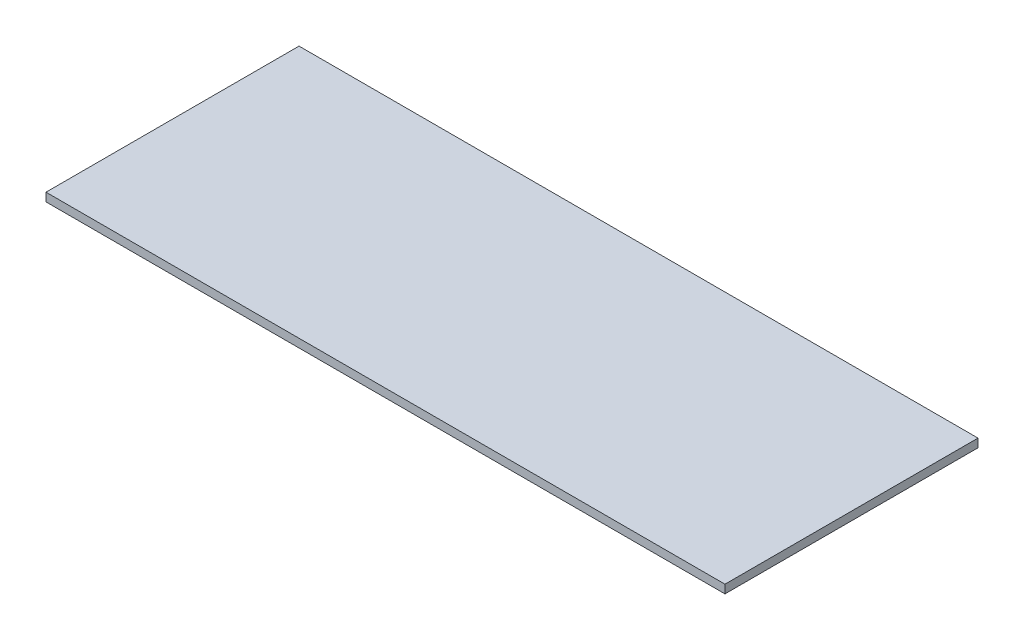
ISO-10303-21;
HEADER;
FILE_DESCRIPTION(('STEP AP214'),'2;1');
FILE_NAME('part.step','',(''),(''),'','','');
FILE_SCHEMA(('AUTOMOTIVE_DESIGN { 1 0 10303 214 1 1 1 1 }'));
ENDSEC;
DATA;
#1=APPLICATION_CONTEXT('core data for automotive mechanical design processes');
#2=APPLICATION_PROTOCOL_DEFINITION('international standard','automotive_design',2000,#1);
#3=PRODUCT_CONTEXT('',#1,'mechanical');
#4=PRODUCT('Part','Part','',(#3));
#5=PRODUCT_RELATED_PRODUCT_CATEGORY('part','',(#4));
#6=PRODUCT_DEFINITION_FORMATION('','',#4);
#7=PRODUCT_DEFINITION_CONTEXT('part definition',#1,'design');
#8=PRODUCT_DEFINITION('design','',#6,#7);
#9=PRODUCT_DEFINITION_SHAPE('','',#8);
#10=(LENGTH_UNIT() NAMED_UNIT(*) SI_UNIT(.MILLI.,.METRE.));
#11=(NAMED_UNIT(*) PLANE_ANGLE_UNIT() SI_UNIT($,.RADIAN.));
#12=(NAMED_UNIT(*) SI_UNIT($,.STERADIAN.) SOLID_ANGLE_UNIT());
#13=UNCERTAINTY_MEASURE_WITH_UNIT(LENGTH_MEASURE(1.E-05),#10,'distance_accuracy_value','');
#14=(GEOMETRIC_REPRESENTATION_CONTEXT(3) GLOBAL_UNCERTAINTY_ASSIGNED_CONTEXT((#13)) GLOBAL_UNIT_ASSIGNED_CONTEXT((#10,
#11,#12)) REPRESENTATION_CONTEXT('',''));
#15=CARTESIAN_POINT('',(0.,0.,0.));
#16=DIRECTION('',(0.,0.,1.));
#17=DIRECTION('',(1.,0.,0.));
#18=AXIS2_PLACEMENT_3D('',#15,#16,#17);
#19=CARTESIAN_POINT('',(0.,6.35,0.));
#20=DIRECTION('',(0.,1.,0.));
#21=DIRECTION('',(0.,0.,1.));
#22=AXIS2_PLACEMENT_3D('',#19,#20,#21);
#23=PLANE('',#22);
#24=DIRECTION('',(0.,0.,-1.));
#25=VECTOR('',#24,1.);
#26=CARTESIAN_POINT('',(123.819999999999,6.35,95.250000000004));
#27=LINE('',#26,#25);
#28=CARTESIAN_POINT('',(123.819999999999,6.35,95.250000000004));
#29=VERTEX_POINT('',#28);
#30=CARTESIAN_POINT('',(123.819999999999,6.35,-95.249999999996));
#31=VERTEX_POINT('',#30);
#32=EDGE_CURVE('E86',#29,#31,#27,.T.);
#33=ORIENTED_EDGE('',*,*,#32,.T.);
#34=DIRECTION('',(-1.,0.,0.));
#35=VECTOR('',#34,1.);
#36=CARTESIAN_POINT('',(-387.350000000001,6.35,-95.249999999996));
#37=LINE('',#36,#35);
#38=CARTESIAN_POINT('',(-387.350000000001,6.35,-95.249999999996));
#39=VERTEX_POINT('',#38);
#40=EDGE_CURVE('E95',#31,#39,#37,.T.);
#41=ORIENTED_EDGE('',*,*,#40,.T.);
#42=DIRECTION('',(0.,0.,1.));
#43=VECTOR('',#42,1.);
#44=CARTESIAN_POINT('',(-387.350000000001,6.35,-95.249999999996));
#45=LINE('',#44,#43);
#46=CARTESIAN_POINT('',(-387.350000000001,6.35,95.250000000004));
#47=VERTEX_POINT('',#46);
#48=EDGE_CURVE('E110',#39,#47,#45,.T.);
#49=ORIENTED_EDGE('',*,*,#48,.T.);
#50=DIRECTION('',(1.,0.,0.));
#51=VECTOR('',#50,1.);
#52=CARTESIAN_POINT('',(-387.350000000001,6.35,95.250000000004));
#53=LINE('',#52,#51);
#54=EDGE_CURVE('E98',#47,#29,#53,.T.);
#55=ORIENTED_EDGE('',*,*,#54,.T.);
#56=EDGE_LOOP('',(#33,#41,#49,#55));
#57=FACE_BOUND('',#56,.T.);
#58=ADVANCED_FACE('F42',(#57),#23,.T.);
#59=CARTESIAN_POINT('',(-387.350000000001,-797.778377746602,95.250000000004));
#60=DIRECTION('',(0.,0.,1.));
#61=DIRECTION('',(1.,0.,0.));
#62=AXIS2_PLACEMENT_3D('',#59,#60,#61);
#63=PLANE('',#62);
#64=DIRECTION('',(0.,-1.,0.));
#65=VECTOR('',#64,1.);
#66=CARTESIAN_POINT('',(123.819999999999,6.35,95.250000000004));
#67=LINE('',#66,#65);
#68=CARTESIAN_POINT('',(123.819999999999,0.,95.250000000004));
#69=VERTEX_POINT('',#68);
#70=EDGE_CURVE('E60',#29,#69,#67,.T.);
#71=ORIENTED_EDGE('',*,*,#70,.F.);
#72=ORIENTED_EDGE('',*,*,#54,.F.);
#73=DIRECTION('',(0.,1.,0.));
#74=VECTOR('',#73,1.);
#75=CARTESIAN_POINT('',(-387.350000000001,-797.778377746602,95.250000000004));
#76=LINE('',#75,#74);
#77=CARTESIAN_POINT('',(-387.350000000001,0.,95.250000000004));
#78=VERTEX_POINT('',#77);
#79=EDGE_CURVE('E46',#78,#47,#76,.T.);
#80=ORIENTED_EDGE('',*,*,#79,.F.);
#81=DIRECTION('',(-1.,0.,0.));
#82=VECTOR('',#81,1.);
#83=CARTESIAN_POINT('',(-387.350000000001,0.,95.250000000004));
#84=LINE('',#83,#82);
#85=EDGE_CURVE('E11',#69,#78,#84,.T.);
#86=ORIENTED_EDGE('',*,*,#85,.F.);
#87=EDGE_LOOP('',(#71,#72,#80,#86));
#88=FACE_BOUND('',#87,.T.);
#89=ADVANCED_FACE('F136',(#88),#63,.T.);
#90=CARTESIAN_POINT('',(-387.350000000001,-797.778377746602,-95.249999999996));
#91=DIRECTION('',(0.,0.,-1.));
#92=DIRECTION('',(-1.,0.,0.));
#93=AXIS2_PLACEMENT_3D('',#90,#91,#92);
#94=PLANE('',#93);
#95=DIRECTION('',(0.,-1.,0.));
#96=VECTOR('',#95,1.);
#97=CARTESIAN_POINT('',(123.819999999999,6.35,-95.249999999996));
#98=LINE('',#97,#96);
#99=CARTESIAN_POINT('',(123.819999999999,0.,-95.249999999996));
#100=VERTEX_POINT('',#99);
#101=EDGE_CURVE('E83',#31,#100,#98,.T.);
#102=ORIENTED_EDGE('',*,*,#101,.T.);
#103=DIRECTION('',(1.,0.,0.));
#104=VECTOR('',#103,1.);
#105=CARTESIAN_POINT('',(-387.350000000001,0.,-95.249999999996));
#106=LINE('',#105,#104);
#107=CARTESIAN_POINT('',(-387.350000000001,0.,-95.249999999996));
#108=VERTEX_POINT('',#107);
#109=EDGE_CURVE('E114',#108,#100,#106,.T.);
#110=ORIENTED_EDGE('',*,*,#109,.F.);
#111=DIRECTION('',(0.,1.,0.));
#112=VECTOR('',#111,1.);
#113=CARTESIAN_POINT('',(-387.350000000001,-797.778377746602,-95.249999999996));
#114=LINE('',#113,#112);
#115=EDGE_CURVE('E103',#108,#39,#114,.T.);
#116=ORIENTED_EDGE('',*,*,#115,.T.);
#117=ORIENTED_EDGE('',*,*,#40,.F.);
#118=EDGE_LOOP('',(#102,#110,#116,#117));
#119=FACE_BOUND('',#118,.T.);
#120=ADVANCED_FACE('F101',(#119),#94,.T.);
#121=CARTESIAN_POINT('',(-387.350000000001,-797.778377746602,-95.249999999996));
#122=DIRECTION('',(-1.,0.,0.));
#123=DIRECTION('',(0.,0.,1.));
#124=AXIS2_PLACEMENT_3D('',#121,#122,#123);
#125=PLANE('',#124);
#126=DIRECTION('',(0.,0.,-1.));
#127=VECTOR('',#126,1.);
#128=CARTESIAN_POINT('',(-387.350000000001,0.,-95.249999999996));
#129=LINE('',#128,#127);
#130=EDGE_CURVE('E52',#78,#108,#129,.T.);
#131=ORIENTED_EDGE('',*,*,#130,.F.);
#132=ORIENTED_EDGE('',*,*,#79,.T.);
#133=ORIENTED_EDGE('',*,*,#48,.F.);
#134=ORIENTED_EDGE('',*,*,#115,.F.);
#135=EDGE_LOOP('',(#131,#132,#133,#134));
#136=FACE_BOUND('',#135,.T.);
#137=ADVANCED_FACE('F132',(#136),#125,.T.);
#138=CARTESIAN_POINT('',(0.,0.,0.));
#139=DIRECTION('',(0.,1.,0.));
#140=DIRECTION('',(0.,0.,1.));
#141=AXIS2_PLACEMENT_3D('',#138,#139,#140);
#142=PLANE('',#141);
#143=ORIENTED_EDGE('',*,*,#109,.T.);
#144=DIRECTION('',(0.,0.,-1.));
#145=VECTOR('',#144,1.);
#146=CARTESIAN_POINT('',(123.819999999999,0.,95.250000000004));
#147=LINE('',#146,#145);
#148=EDGE_CURVE('E87',#69,#100,#147,.T.);
#149=ORIENTED_EDGE('',*,*,#148,.F.);
#150=ORIENTED_EDGE('',*,*,#85,.T.);
#151=ORIENTED_EDGE('',*,*,#130,.T.);
#152=EDGE_LOOP('',(#143,#149,#150,#151));
#153=FACE_BOUND('',#152,.T.);
#154=ADVANCED_FACE('F44',(#153),#142,.F.);
#155=CARTESIAN_POINT('',(123.819999999999,6.35,95.250000000004));
#156=DIRECTION('',(-1.,0.,0.));
#157=DIRECTION('',(0.,0.,1.));
#158=AXIS2_PLACEMENT_3D('',#155,#156,#157);
#159=PLANE('',#158);
#160=ORIENTED_EDGE('',*,*,#148,.T.);
#161=ORIENTED_EDGE('',*,*,#101,.F.);
#162=ORIENTED_EDGE('',*,*,#32,.F.);
#163=ORIENTED_EDGE('',*,*,#70,.T.);
#164=EDGE_LOOP('',(#160,#161,#162,#163));
#165=FACE_BOUND('',#164,.T.);
#166=ADVANCED_FACE('F85',(#165),#159,.F.);
#167=CLOSED_SHELL('',(#58,#89,#120,#137,#154,#166));
#168=MANIFOLD_SOLID_BREP('B2',#167);
#169=ADVANCED_BREP_SHAPE_REPRESENTATION('',(#18,#168),#14);
#170=SHAPE_DEFINITION_REPRESENTATION(#9,#169);
ENDSEC;
END-ISO-10303-21;
